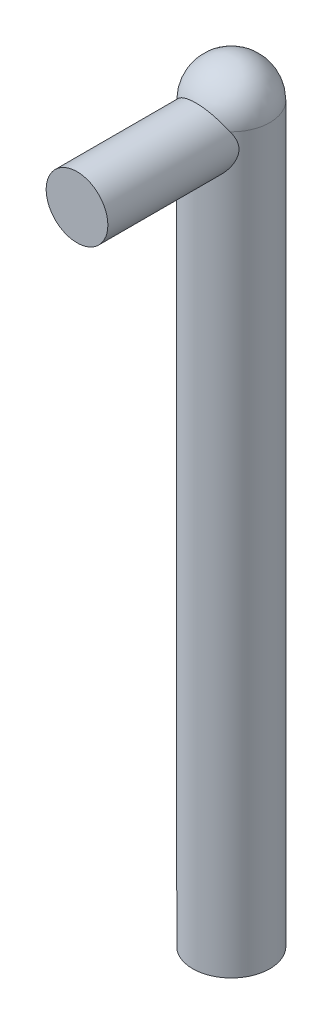
ISO-10303-21;
HEADER;
FILE_DESCRIPTION(('STEP AP214'),'2;1');
FILE_NAME('part.step','',(''),(''),'','','');
FILE_SCHEMA(('AUTOMOTIVE_DESIGN { 1 0 10303 214 1 1 1 1 }'));
ENDSEC;
DATA;
#1=APPLICATION_CONTEXT('core data for automotive mechanical design processes');
#2=APPLICATION_PROTOCOL_DEFINITION('international standard','automotive_design',2000,#1);
#3=PRODUCT_CONTEXT('',#1,'mechanical');
#4=PRODUCT('Part','Part','',(#3));
#5=PRODUCT_RELATED_PRODUCT_CATEGORY('part','',(#4));
#6=PRODUCT_DEFINITION_FORMATION('','',#4);
#7=PRODUCT_DEFINITION_CONTEXT('part definition',#1,'design');
#8=PRODUCT_DEFINITION('design','',#6,#7);
#9=PRODUCT_DEFINITION_SHAPE('','',#8);
#10=(LENGTH_UNIT() NAMED_UNIT(*) SI_UNIT(.MILLI.,.METRE.));
#11=(NAMED_UNIT(*) PLANE_ANGLE_UNIT() SI_UNIT($,.RADIAN.));
#12=(NAMED_UNIT(*) SI_UNIT($,.STERADIAN.) SOLID_ANGLE_UNIT());
#13=UNCERTAINTY_MEASURE_WITH_UNIT(LENGTH_MEASURE(1.E-05),#10,'distance_accuracy_value','');
#14=(GEOMETRIC_REPRESENTATION_CONTEXT(3) GLOBAL_UNCERTAINTY_ASSIGNED_CONTEXT((#13)) GLOBAL_UNIT_ASSIGNED_CONTEXT((#10,
#11,#12)) REPRESENTATION_CONTEXT('',''));
#15=CARTESIAN_POINT('',(0.,0.,0.));
#16=DIRECTION('',(0.,0.,1.));
#17=DIRECTION('',(1.,0.,0.));
#18=AXIS2_PLACEMENT_3D('',#15,#16,#17);
#19=CARTESIAN_POINT('',(0.,500.,0.));
#20=DIRECTION('',(0.,-1.,0.));
#21=DIRECTION('',(0.,0.,-1.));
#22=AXIS2_PLACEMENT_3D('',#19,#20,#21);
#23=CYLINDRICAL_SURFACE('',#22,25.);
#24=CARTESIAN_POINT('',(0.,0.,0.));
#25=DIRECTION('',(0.,1.,0.));
#26=DIRECTION('',(0.,0.,1.));
#27=AXIS2_PLACEMENT_3D('',#24,#25,#26);
#28=CIRCLE('',#27,25.);
#29=CARTESIAN_POINT('',(0.,0.,25.));
#30=VERTEX_POINT('',#29);
#31=EDGE_CURVE('E61',#30,#30,#28,.T.);
#32=ORIENTED_EDGE('',*,*,#31,.T.);
#33=EDGE_LOOP('',(#32));
#34=FACE_BOUND('',#33,.T.);
#35=CARTESIAN_POINT('',(-17.3205080756888,475.,18.0277563773199));
#36=CARTESIAN_POINT('',(-17.4243895453768,474.820065429361,17.9279522800386));
#37=CARTESIAN_POINT('',(-17.525654718802,474.638200609103,17.8289306189595));
#38=CARTESIAN_POINT('',(-17.7228869681249,474.270535703855,17.6328841815829));
#39=CARTESIAN_POINT('',(-17.8188534982779,474.08473521622,17.535859611623));
#40=CARTESIAN_POINT('',(-18.0989459096631,473.520829957276,17.24818267159));
#41=CARTESIAN_POINT('',(-18.2749630672693,473.136742556274,17.0612189095588));
#42=CARTESIAN_POINT('',(-18.6066885749108,472.346920109974,16.6988726887926));
#43=CARTESIAN_POINT('',(-18.7620711117398,471.940954296616,16.5236936765112));
#44=CARTESIAN_POINT('',(-19.0480200636037,471.112666100961,16.1932286316932));
#45=CARTESIAN_POINT('',(-19.1786011214989,470.69035354825,16.037930878974));
#46=CARTESIAN_POINT('',(-19.3898953635968,469.915253994639,15.7814405166596));
#47=CARTESIAN_POINT('',(-19.4753623490989,469.565295425271,15.6756262869567));
#48=CARTESIAN_POINT('',(-19.6281130612469,468.855999655456,15.4839342177953));
#49=CARTESIAN_POINT('',(-19.6953973259876,468.496662732896,15.3980557883726));
#50=CARTESIAN_POINT('',(-19.8103144561317,467.77220809946,15.2499251633839));
#51=CARTESIAN_POINT('',(-19.8580583192556,467.407135627829,15.1875396843915));
#52=CARTESIAN_POINT('',(-19.9334638919983,466.671437666484,15.0884369335332));
#53=CARTESIAN_POINT('',(-19.9611266795955,466.300812475937,15.0517182838422));
#54=CARTESIAN_POINT('',(-19.9958474720831,465.553971769348,15.0055639801115));
#55=CARTESIAN_POINT('',(-20.0027434048087,465.177735194709,14.9963429328795));
#56=CARTESIAN_POINT('',(-19.9952923291665,464.425859175305,15.0062759098772));
#57=CARTESIAN_POINT('',(-19.9809454831577,464.050219726,15.0254297172374));
#58=CARTESIAN_POINT('',(-19.9313217872671,463.301965690573,15.0911922916158));
#59=CARTESIAN_POINT('',(-19.8960000244324,462.929359339801,15.1378599717141));
#60=CARTESIAN_POINT('',(-19.8052112639643,462.19069985506,15.2564457822608));
#61=CARTESIAN_POINT('',(-19.7497411243365,461.824647752526,15.3283678508913));
#62=CARTESIAN_POINT('',(-19.604405622149,461.015839430789,15.5140014549542));
#63=CARTESIAN_POINT('',(-19.50951560575,460.575331935447,15.6335665188487));
#64=CARTESIAN_POINT('',(-19.2927753888188,459.709617180097,15.9002599779378));
#65=CARTESIAN_POINT('',(-19.1709172083886,459.284414492181,16.0473965295748));
#66=CARTESIAN_POINT('',(-18.901898671641,458.44934354091,16.3634147995072));
#67=CARTESIAN_POINT('',(-18.7546827563513,458.039511407692,16.5323440573057));
#68=CARTESIAN_POINT('',(-18.4367035953814,457.23633220761,16.8862253504921));
#69=CARTESIAN_POINT('',(-18.2659392159177,456.842985935678,17.0711781572033));
#70=CARTESIAN_POINT('',(-17.8191258497335,455.897065458959,17.5392580884147));
#71=CARTESIAN_POINT('',(-17.5305387515127,455.353530112884,17.8287452383162));
#72=CARTESIAN_POINT('',(-16.9081318016051,454.30002128811,18.4200888224742));
#73=CARTESIAN_POINT('',(-16.5742935959392,453.790061553123,18.7219502409332));
#74=CARTESIAN_POINT('',(-15.8622189405477,452.803258745191,19.328971623809));
#75=CARTESIAN_POINT('',(-15.4839380368277,452.326449603046,19.6341346088958));
#76=CARTESIAN_POINT('',(-14.6838694202195,451.407538266084,20.2394580715499));
#77=CARTESIAN_POINT('',(-14.2620884770149,450.965430689647,20.5396193190913));
#78=CARTESIAN_POINT('',(-13.3692424709565,450.112093327752,21.1318289617878));
#79=CARTESIAN_POINT('',(-12.8975836799486,449.701366929451,21.4237108678852));
#80=CARTESIAN_POINT('',(-11.9104021911836,448.920872840809,21.9878525349348));
#81=CARTESIAN_POINT('',(-11.3948726492189,448.55111156216,22.2601092219046));
#82=CARTESIAN_POINT('',(-10.3226155793979,447.857956473382,22.7771054975768));
#83=CARTESIAN_POINT('',(-9.76600622589688,447.534436961579,23.0219192788719));
#84=CARTESIAN_POINT('',(-8.9017255468808,447.087308062101,23.3635476075758));
#85=CARTESIAN_POINT('',(-8.60878585693533,446.944642902176,23.473143122867));
#86=CARTESIAN_POINT('',(-8.01341086794019,446.672633504963,23.6830078654019));
#87=CARTESIAN_POINT('',(-7.71097339584238,446.543292345547,23.7832749372393));
#88=CARTESIAN_POINT('',(-6.98945391492473,446.255755144705,24.0069974193181));
#89=CARTESIAN_POINT('',(-6.56671097775218,446.103379402952,24.1262287198391));
#90=CARTESIAN_POINT('',(-5.70715661235167,445.826262384945,24.3438875828664));
#91=CARTESIAN_POINT('',(-5.27034888859079,445.701513899162,24.4423205725321));
#92=CARTESIAN_POINT('',(-4.38519204587477,445.481343889971,24.6165270437289));
#93=CARTESIAN_POINT('',(-3.93684919406692,445.38590679142,24.6923125588306));
#94=CARTESIAN_POINT('',(-3.03129421253858,445.225706881334,24.819756449285));
#95=CARTESIAN_POINT('',(-2.57408176329156,445.160945177023,24.8714139537405));
#96=CARTESIAN_POINT('',(-1.65246345963253,445.06297761431,24.9496289707038));
#97=CARTESIAN_POINT('',(-1.18803763941672,445.029886155385,24.9760954862772));
#98=CARTESIAN_POINT('',(-0.257252158431054,444.99623315484,25.0030115225553));
#99=CARTESIAN_POINT('',(0.209107494423546,444.995671480205,25.0034611496433));
#100=CARTESIAN_POINT('',(1.14005276329587,445.027087912013,24.9783332020993));
#101=CARTESIAN_POINT('',(1.60463824348418,445.059068461649,24.9527536732597));
#102=CARTESIAN_POINT('',(2.52835032239599,445.155024416425,24.8761375999217));
#103=CARTESIAN_POINT('',(2.98747703238075,445.218999168306,24.8251015751942));
#104=CARTESIAN_POINT('',(3.87323182400675,445.373752197386,24.7019742283097));
#105=CARTESIAN_POINT('',(4.30030808233547,445.462963104134,24.6311162553431));
#106=CARTESIAN_POINT('',(5.14400089270875,445.667961424694,24.4688331131003));
#107=CARTESIAN_POINT('',(5.56061789139964,445.783747701497,24.3774088237428));
#108=CARTESIAN_POINT('',(6.38133390801706,446.040477424309,24.1755497600369));
#109=CARTESIAN_POINT('',(6.78543122884763,446.181424263581,24.0651124215769));
#110=CARTESIAN_POINT('',(7.57935345184327,446.486914092695,23.8269846413182));
#111=CARTESIAN_POINT('',(7.96917751832211,446.651458461388,23.6992931913532));
#112=CARTESIAN_POINT('',(8.76942613869026,447.019204441669,23.4156791625782));
#113=CARTESIAN_POINT('',(9.17830376908284,447.22459150029,23.2582281067018));
#114=CARTESIAN_POINT('',(9.97609604170754,447.659757175924,22.927364537469));
#115=CARTESIAN_POINT('',(10.3650096373737,447.88953706974,22.7539511886566));
#116=CARTESIAN_POINT('',(11.1221492628466,448.371731442072,22.3936069118228));
#117=CARTESIAN_POINT('',(11.4903684076604,448.624153381878,22.2066715318103));
#118=CARTESIAN_POINT('',(12.2054836628259,449.149978209887,21.8218032846605));
#119=CARTESIAN_POINT('',(12.5523768801405,449.423383933449,21.6238689323262));
#120=CARTESIAN_POINT('',(13.2935429246398,450.04799690912,21.1779406104083));
#121=CARTESIAN_POINT('',(13.6829138600901,450.403650370638,20.9280145966228));
#122=CARTESIAN_POINT('',(14.4298892068476,451.141643450144,20.4201450206528));
#123=CARTESIAN_POINT('',(14.7874884298167,451.523987408568,20.162200158236));
#124=CARTESIAN_POINT('',(15.4710503517361,452.314574725136,19.6425838631085));
#125=CARTESIAN_POINT('',(15.7969752229142,452.722848111237,19.3809083923272));
#126=CARTESIAN_POINT('',(16.4163375028442,453.564233822093,18.8591554579843));
#127=CARTESIAN_POINT('',(16.7097786343493,453.99734329189,18.5990778145393));
#128=CARTESIAN_POINT('',(17.2388968096944,454.848706293264,18.1090760687299));
#129=CARTESIAN_POINT('',(17.4773905892268,455.264850452568,17.8785286072324));
#130=CARTESIAN_POINT('',(17.9260743258721,456.118096289216,17.4286189986406));
#131=CARTESIAN_POINT('',(18.1362608809756,456.555200477026,17.2092581979428));
#132=CARTESIAN_POINT('',(18.5265837424332,457.449930823791,16.7883273687829));
#133=CARTESIAN_POINT('',(18.7067698814354,457.907521316018,16.5867281049688));
#134=CARTESIAN_POINT('',(19.0354500424178,458.843900064403,16.2084672024602));
#135=CARTESIAN_POINT('',(19.1839588053674,459.322678335097,16.0317939775262));
#136=CARTESIAN_POINT('',(19.4064539496161,460.150973787534,15.7610351987412));
#137=CARTESIAN_POINT('',(19.4893426363991,460.495256306169,15.658214197912));
#138=CARTESIAN_POINT('',(19.6375038808176,461.192711351072,15.4719943082917));
#139=CARTESIAN_POINT('',(19.7027821748889,461.54588094137,15.3885890961889));
#140=CARTESIAN_POINT('',(19.8145701007754,462.259050879483,15.2443811972445));
#141=CARTESIAN_POINT('',(19.8611161019492,462.619036556108,15.1835347301404));
#142=CARTESIAN_POINT('',(19.934685954447,463.344363551506,15.0868160897153));
#143=CARTESIAN_POINT('',(19.9617102729979,463.709704741888,15.050943318681));
#144=CARTESIAN_POINT('',(19.9957105521223,464.445159645611,15.0057451434052));
#145=CARTESIAN_POINT('',(20.0025668617283,464.81528880878,14.9965781800705));
#146=CARTESIAN_POINT('',(19.9957191223037,465.555006126917,15.0057070385543));
#147=CARTESIAN_POINT('',(19.9820152972889,465.924594287735,15.0240025611516));
#148=CARTESIAN_POINT('',(19.9343490517018,466.660721465092,15.0871889975678));
#149=CARTESIAN_POINT('',(19.9003551346185,467.027254840819,15.1321212591225));
#150=CARTESIAN_POINT('',(19.8128518168229,467.754083220169,15.2465092838177));
#151=CARTESIAN_POINT('',(19.7593398834822,468.114377407847,15.3159682294666));
#152=CARTESIAN_POINT('',(19.6181337422506,468.915751489754,15.4966138511922));
#153=CARTESIAN_POINT('',(19.5252409028354,469.354541971592,15.613888973161));
#154=CARTESIAN_POINT('',(19.312667891179,470.217126674625,15.8760592714008));
#155=CARTESIAN_POINT('',(19.1929767935733,470.640914697638,16.0209657090805));
#156=CARTESIAN_POINT('',(18.9285720642984,471.47302409832,16.33251188935));
#157=CARTESIAN_POINT('',(18.7838226448466,471.881322322868,16.4991826304656));
#158=CARTESIAN_POINT('',(18.4710230100084,472.681523389939,16.8486280218801));
#159=CARTESIAN_POINT('',(18.3029805963454,473.073431665114,17.0313972727249));
#160=CARTESIAN_POINT('',(18.0000669380496,473.722574990705,17.3502136689817));
#161=CARTESIAN_POINT('',(17.8709782410925,473.98402316241,17.4832585902917));
#162=CARTESIAN_POINT('',(17.603063789738,474.498193824401,17.7529776139987));
#163=CARTESIAN_POINT('',(17.4642833872142,474.750949651757,17.8896331679832));
#164=CARTESIAN_POINT('',(17.3205080756888,475.,18.0277563773199));
#165=B_SPLINE_CURVE_WITH_KNOTS('',3,(#35,#36,#37,#38,#39,#40,#41,#42,#43,#44,#45,#46,#47,#48,
#49,#50,#51,#52,#53,#54,#55,#56,#57,#58,#59,#60,#61,#62,#63,#64,#65,#66,#67,#68,#69,#70,#71,#72,
#73,#74,#75,#76,#77,#78,#79,#80,#81,#82,#83,#84,#85,#86,#87,#88,#89,#90,#91,#92,#93,#94,#95,#96,
#97,#98,#99,#100,#101,#102,#103,#104,#105,#106,#107,#108,#109,#110,#111,#112,#113,#114,#115,
#116,#117,#118,#119,#120,#121,#122,#123,#124,#125,#126,#127,#128,#129,#130,#131,#132,#133,#134,
#135,#136,#137,#138,#139,#140,#141,#142,#143,#144,#145,#146,#147,#148,#149,#150,#151,#152,#153,
#154,#155,#156,#157,#158,#159,#160,#161,#162,#163,#164),.UNSPECIFIED.,.F.,.F.,(4,2,2,2,2,2,2,2,
2,2,2,2,2,2,2,2,2,2,2,2,2,2,2,2,2,2,2,2,2,2,2,2,2,2,2,2,2,2,2,2,2,2,2,2,2,2,2,2,2,2,2,2,2,2,2,2,
2,2,2,2,2,2,2,2,4),(0.,0.691439701577484,1.38295048706675,2.76797607205562,4.17277491851992,
5.57674177206299,6.70217595294945,7.82757682437852,8.94649312176521,10.0653493498176,
11.1929152031196,12.320472438457,13.4504528283972,14.5806095063629,15.9770503050591,
17.3739048653295,18.7738598056848,20.1738821729594,22.2113023924596,24.2495514821515,
26.2898569805974,28.3298454347296,30.3976574380571,32.4657926310032,34.5281943796653,
35.5590715033535,36.5901862303649,37.9834452373871,39.3763402339534,40.7684938045667,
42.1606976208764,43.5579115936079,44.9551198531195,46.3524330194674,47.7497176566294,
49.0743184601552,50.3988626021261,51.7235855130606,53.0483858617088,54.4986898962611,
55.9490698819917,57.3999295833292,58.850985673336,60.6000662614235,62.3494319523611,
64.100861827633,65.852090774492,67.4474352862198,69.0429713583406,70.6358301127957,
72.2279460103889,73.3332862792042,74.43826605687,75.5410900086079,76.6438875647621,
77.7532146344463,78.8625296173966,79.9735710958694,81.0847567927319,82.4733744905521,
83.8625593472111,85.2537448284908,86.6444654689107,87.605697892769,88.5627000396511),.UNSPECIFIED.);
#166=CARTESIAN_POINT('',(-17.3205080756888,475.,18.0277563773199));
#167=VERTEX_POINT('',#166);
#168=CARTESIAN_POINT('',(17.3205080756888,475.,18.0277563773199));
#169=VERTEX_POINT('',#168);
#170=EDGE_CURVE('E55',#167,#169,#165,.T.);
#171=ORIENTED_EDGE('',*,*,#170,.F.);
#172=CARTESIAN_POINT('',(0.,475.,0.));
#173=DIRECTION('',(0.,-1.,0.));
#174=DIRECTION('',(0.,0.,-1.));
#175=AXIS2_PLACEMENT_3D('',#172,#173,#174);
#176=CIRCLE('',#175,25.);
#177=EDGE_CURVE('E49',#167,#169,#176,.T.);
#178=ORIENTED_EDGE('',*,*,#177,.T.);
#179=EDGE_LOOP('',(#171,#178));
#180=FACE_BOUND('',#179,.T.);
#181=ADVANCED_FACE('F35',(#34,#180),#23,.T.);
#182=CARTESIAN_POINT('',(0.,475.,0.));
#183=DIRECTION('',(0.,1.,0.));
#184=DIRECTION('',(0.,0.,1.));
#185=AXIS2_PLACEMENT_3D('',#182,#183,#184);
#186=SPHERICAL_SURFACE('',#185,25.);
#187=ORIENTED_EDGE('',*,*,#177,.F.);
#188=CARTESIAN_POINT('',(-17.320623544203,474.9998,18.0276454369393));
#189=CARTESIAN_POINT('',(-17.1897527625717,475.226482944408,18.1533857490392));
#190=CARTESIAN_POINT('',(-17.0539072652591,475.451499341951,18.2768891802271));
#191=CARTESIAN_POINT('',(-16.7722828468885,475.897712880003,18.5194216251042));
#192=CARTESIAN_POINT('',(-16.6265034155796,476.118909823597,18.6384504084677));
#193=CARTESIAN_POINT('',(-16.1742571465451,476.77608303403,18.9888450758955));
#194=CARTESIAN_POINT('',(-15.8529275340761,477.205563070891,19.2134758584855));
#195=CARTESIAN_POINT('',(-15.1708682502653,478.043676471345,19.6448512032948));
#196=CARTESIAN_POINT('',(-14.810040124325,478.452253838143,19.8515486577461));
#197=CARTESIAN_POINT('',(-14.0511510383273,479.243082316026,20.2460004729506));
#198=CARTESIAN_POINT('',(-13.6530951681339,479.625337013635,20.4337574160197));
#199=CARTESIAN_POINT('',(-12.8205335696692,480.360442683589,20.7904004065816));
#200=CARTESIAN_POINT('',(-12.3859255256225,480.713205208492,20.9592301735059));
#201=CARTESIAN_POINT('',(-11.4838170845336,481.384074858885,21.2769060453411));
#202=CARTESIAN_POINT('',(-11.0163148459526,481.702180041583,21.4257510300711));
#203=CARTESIAN_POINT('',(-10.0522616375813,482.299512351804,21.7027510974684));
#204=CARTESIAN_POINT('',(-9.55575322551023,482.578794501966,21.830935503694));
#205=CARTESIAN_POINT('',(-8.53673185515259,483.095593840567,22.066393956393));
#206=CARTESIAN_POINT('',(-8.01422085331341,483.333114165107,22.1736695730768));
#207=CARTESIAN_POINT('',(-6.97952212397661,483.750424924792,22.3610539392531));
#208=CARTESIAN_POINT('',(-6.46861556555335,483.932834902801,22.442411802649));
#209=CARTESIAN_POINT('',(-5.43119844950775,484.256095776251,22.5859928678264));
#210=CARTESIAN_POINT('',(-4.90468841324378,484.396948058537,22.6482167081437));
#211=CARTESIAN_POINT('',(-3.839984374618,484.635483301107,22.753294878875));
#212=CARTESIAN_POINT('',(-3.30178841624112,484.733158975038,22.7961459400262));
#213=CARTESIAN_POINT('',(-2.21802452984813,484.884156242452,22.8622882065726));
#214=CARTESIAN_POINT('',(-1.67245682787193,484.937479192802,22.8855800103369));
#215=CARTESIAN_POINT('',(-0.604970741116645,484.997643590196,22.9118534598566));
#216=CARTESIAN_POINT('',(-0.0831944207901494,485.006622037145,22.9157688890543));
#217=CARTESIAN_POINT('',(0.959280888856211,484.983782718273,22.9058001611504));
#218=CARTESIAN_POINT('',(1.47997991871465,484.951966516594,22.891916686491));
#219=CARTESIAN_POINT('',(2.51642242701958,484.847892381384,22.8464081179847));
#220=CARTESIAN_POINT('',(3.03216691594575,484.77564288034,22.8147867234313));
#221=CARTESIAN_POINT('',(4.05511953299707,484.591480087825,22.7339225748252));
#222=CARTESIAN_POINT('',(4.5623276231642,484.479566620033,22.6846797424386));
#223=CARTESIAN_POINT('',(5.56019569675106,484.218424833979,22.5692665879655));
#224=CARTESIAN_POINT('',(6.05096257162154,484.069536383116,22.5032503230734));
#225=CARTESIAN_POINT('',(7.01733506851402,483.735484404985,22.3543112639146));
#226=CARTESIAN_POINT('',(7.49294082762174,483.550321205818,22.2713886225645));
#227=CARTESIAN_POINT('',(8.42596338595878,483.145570780059,22.0889053286142));
#228=CARTESIAN_POINT('',(8.88337977822859,482.925982783806,21.9893443040145));
#229=CARTESIAN_POINT('',(9.77723986490228,482.454538333536,21.7738919188663));
#230=CARTESIAN_POINT('',(10.2136833964087,482.202681628941,21.6580004315056));
#231=CARTESIAN_POINT('',(11.075407339289,481.661382288256,21.4066320351093));
#232=CARTESIAN_POINT('',(11.5000005484204,481.371063730176,21.2706858777199));
#233=CARTESIAN_POINT('',(12.3220412233896,480.761634971114,20.9822187331538));
#234=CARTESIAN_POINT('',(12.7194866696994,480.442522632247,20.8296965150625));
#235=CARTESIAN_POINT('',(13.4852845091078,479.778496004813,20.5084305044532));
#236=CARTESIAN_POINT('',(13.8536331194015,479.433578372679,20.3396846090386));
#237=CARTESIAN_POINT('',(14.5594753124269,478.721266134137,19.986408436051));
#238=CARTESIAN_POINT('',(14.8969753302977,478.353876242345,19.8018814660906));
#239=CARTESIAN_POINT('',(15.6201393090392,477.505760302054,19.3693803666861));
#240=CARTESIAN_POINT('',(15.9968796189295,477.019586944389,19.1170466484709));
#241=CARTESIAN_POINT('',(16.5227835383673,476.27342397861,18.7212666967498));
#242=CARTESIAN_POINT('',(16.6913699770171,476.022200097262,18.5866335177686));
#243=CARTESIAN_POINT('',(17.0156673324205,475.514643585412,18.3115201935587));
#244=CARTESIAN_POINT('',(17.1713767823357,475.258310377015,18.1710393849497));
#245=CARTESIAN_POINT('',(17.320623544203,474.9998,18.0276454369393));
#246=B_SPLINE_CURVE_WITH_KNOTS('',3,(#188,#189,#190,#191,#192,#193,#194,#195,#196,#197,#198,
#199,#200,#201,#202,#203,#204,#205,#206,#207,#208,#209,#210,#211,#212,#213,#214,#215,#216,#217,
#218,#219,#220,#221,#222,#223,#224,#225,#226,#227,#228,#229,#230,#231,#232,#233,#234,#235,#236,
#237,#238,#239,#240,#241,#242,#243,#244,#245),.UNSPECIFIED.,.F.,.F.,(4,2,2,2,2,2,2,2,2,2,2,2,2,
2,2,2,2,2,2,2,2,2,2,2,2,2,2,2,4),(0.,0.87103811217203,1.74212099849632,3.48458750996628,
5.23150072088334,6.97817543793671,8.72991340577442,10.4817495205396,12.2310769330643,
13.980272923764,15.6238674821531,17.2674071849657,18.9112241406865,20.5549908058875,
22.1187133519232,23.6823759437952,25.2457125505733,26.8090561070607,28.3585296369198,
29.9079891525737,31.4574833155548,33.0069895116046,34.6012792499338,36.195687458951,
37.7903026128916,39.3845843609485,41.3757243639019,42.3688929929699,43.3621746000838),.UNSPECIFIED.);
#247=EDGE_CURVE('E11',#167,#169,#246,.T.);
#248=ORIENTED_EDGE('',*,*,#247,.T.);
#249=EDGE_LOOP('',(#187,#248));
#250=FACE_BOUND('',#249,.T.);
#251=ADVANCED_FACE('F37',(#250),#186,.T.);
#252=CARTESIAN_POINT('',(0.,0.,0.));
#253=DIRECTION('',(0.,1.,0.));
#254=DIRECTION('',(0.,0.,1.));
#255=AXIS2_PLACEMENT_3D('',#252,#253,#254);
#256=PLANE('',#255);
#257=ORIENTED_EDGE('',*,*,#31,.F.);
#258=EDGE_LOOP('',(#257));
#259=FACE_BOUND('',#258,.T.);
#260=ADVANCED_FACE('F77',(#259),#256,.F.);
#261=CARTESIAN_POINT('',(0.,465.,100.));
#262=DIRECTION('',(0.,0.,-1.));
#263=DIRECTION('',(-1.,0.,0.));
#264=AXIS2_PLACEMENT_3D('',#261,#262,#263);
#265=CYLINDRICAL_SURFACE('',#264,20.);
#266=CARTESIAN_POINT('',(0.,465.,100.));
#267=DIRECTION('',(0.,0.,1.));
#268=DIRECTION('',(1.,0.,0.));
#269=AXIS2_PLACEMENT_3D('',#266,#267,#268);
#270=CIRCLE('',#269,20.);
#271=CARTESIAN_POINT('',(20.,465.,100.));
#272=VERTEX_POINT('',#271);
#273=EDGE_CURVE('E62',#272,#272,#270,.T.);
#274=ORIENTED_EDGE('',*,*,#273,.F.);
#275=EDGE_LOOP('',(#274));
#276=FACE_BOUND('',#275,.T.);
#277=ORIENTED_EDGE('',*,*,#247,.F.);
#278=ORIENTED_EDGE('',*,*,#170,.T.);
#279=EDGE_LOOP('',(#277,#278));
#280=FACE_BOUND('',#279,.T.);
#281=ADVANCED_FACE('F56',(#276,#280),#265,.T.);
#282=CARTESIAN_POINT('',(0.,465.,100.));
#283=DIRECTION('',(0.,0.,1.));
#284=DIRECTION('',(1.,0.,0.));
#285=AXIS2_PLACEMENT_3D('',#282,#283,#284);
#286=PLANE('',#285);
#287=ORIENTED_EDGE('',*,*,#273,.T.);
#288=EDGE_LOOP('',(#287));
#289=FACE_BOUND('',#288,.T.);
#290=ADVANCED_FACE('F76',(#289),#286,.T.);
#291=CLOSED_SHELL('',(#181,#251,#260,#281,#290));
#292=MANIFOLD_SOLID_BREP('B2',#291);
#293=ADVANCED_BREP_SHAPE_REPRESENTATION('',(#18,#292),#14);
#294=SHAPE_DEFINITION_REPRESENTATION(#9,#293);
ENDSEC;
END-ISO-10303-21;
